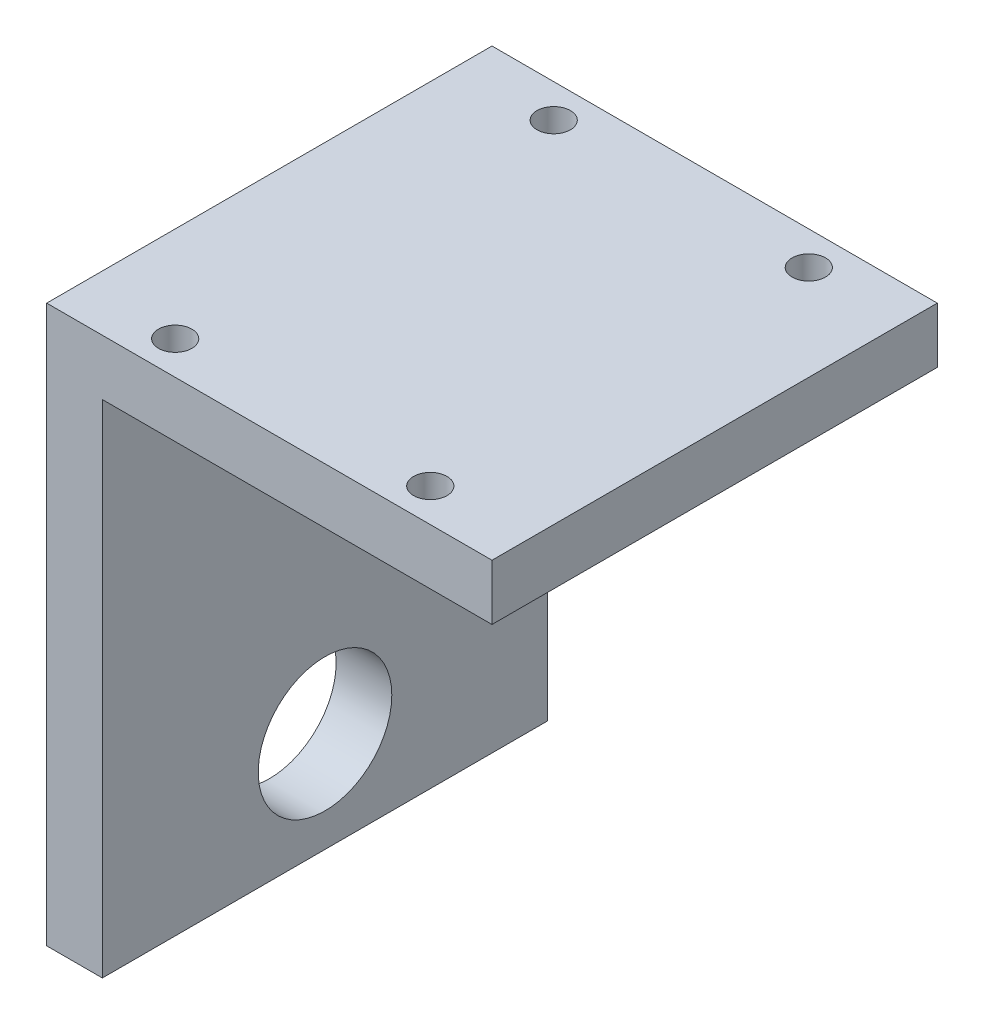
ISO-10303-21;
HEADER;
FILE_DESCRIPTION(('STEP AP214'),'2;1');
FILE_NAME('part.step','',(''),(''),'','','');
FILE_SCHEMA(('AUTOMOTIVE_DESIGN { 1 0 10303 214 1 1 1 1 }'));
ENDSEC;
DATA;
#1=APPLICATION_CONTEXT('core data for automotive mechanical design processes');
#2=APPLICATION_PROTOCOL_DEFINITION('international standard','automotive_design',2000,#1);
#3=PRODUCT_CONTEXT('',#1,'mechanical');
#4=PRODUCT('Part','Part','',(#3));
#5=PRODUCT_RELATED_PRODUCT_CATEGORY('part','',(#4));
#6=PRODUCT_DEFINITION_FORMATION('','',#4);
#7=PRODUCT_DEFINITION_CONTEXT('part definition',#1,'design');
#8=PRODUCT_DEFINITION('design','',#6,#7);
#9=PRODUCT_DEFINITION_SHAPE('','',#8);
#10=(LENGTH_UNIT() NAMED_UNIT(*) SI_UNIT(.MILLI.,.METRE.));
#11=(NAMED_UNIT(*) PLANE_ANGLE_UNIT() SI_UNIT($,.RADIAN.));
#12=(NAMED_UNIT(*) SI_UNIT($,.STERADIAN.) SOLID_ANGLE_UNIT());
#13=UNCERTAINTY_MEASURE_WITH_UNIT(LENGTH_MEASURE(1.E-05),#10,'distance_accuracy_value','');
#14=(GEOMETRIC_REPRESENTATION_CONTEXT(3) GLOBAL_UNCERTAINTY_ASSIGNED_CONTEXT((#13)) GLOBAL_UNIT_ASSIGNED_CONTEXT((#10,
#11,#12)) REPRESENTATION_CONTEXT('',''));
#15=CARTESIAN_POINT('',(0.,0.,0.));
#16=DIRECTION('',(0.,0.,1.));
#17=DIRECTION('',(1.,0.,0.));
#18=AXIS2_PLACEMENT_3D('',#15,#16,#17);
#19=CARTESIAN_POINT('',(0.,0.,0.));
#20=DIRECTION('',(0.,1.,0.));
#21=DIRECTION('',(0.,0.,1.));
#22=AXIS2_PLACEMENT_3D('',#19,#20,#21);
#23=PLANE('',#22);
#24=CARTESIAN_POINT('',(-11.4569960506188,0.,17.));
#25=DIRECTION('',(0.,1.,0.));
#26=DIRECTION('',(0.,0.,1.));
#27=AXIS2_PLACEMENT_3D('',#24,#25,#26);
#28=CIRCLE('',#27,1.5);
#29=CARTESIAN_POINT('',(-11.4569960506188,0.,18.5));
#30=VERTEX_POINT('',#29);
#31=EDGE_CURVE('E283',#30,#30,#28,.T.);
#32=ORIENTED_EDGE('',*,*,#31,.T.);
#33=EDGE_LOOP('',(#32));
#34=FACE_BOUND('',#33,.T.);
#35=CARTESIAN_POINT('',(11.4569960506188,0.,17.));
#36=DIRECTION('',(0.,1.,0.));
#37=DIRECTION('',(0.,0.,1.));
#38=AXIS2_PLACEMENT_3D('',#35,#36,#37);
#39=CIRCLE('',#38,1.5);
#40=CARTESIAN_POINT('',(11.4569960506188,0.,18.5));
#41=VERTEX_POINT('',#40);
#42=EDGE_CURVE('E286',#41,#41,#39,.T.);
#43=ORIENTED_EDGE('',*,*,#42,.T.);
#44=EDGE_LOOP('',(#43));
#45=FACE_BOUND('',#44,.T.);
#46=CARTESIAN_POINT('',(11.4569960506188,0.,-17.));
#47=DIRECTION('',(0.,1.,0.));
#48=DIRECTION('',(0.,0.,1.));
#49=AXIS2_PLACEMENT_3D('',#46,#47,#48);
#50=CIRCLE('',#49,1.5);
#51=CARTESIAN_POINT('',(11.4569960506188,0.,-15.5));
#52=VERTEX_POINT('',#51);
#53=EDGE_CURVE('E295',#52,#52,#50,.T.);
#54=ORIENTED_EDGE('',*,*,#53,.T.);
#55=EDGE_LOOP('',(#54));
#56=FACE_BOUND('',#55,.T.);
#57=CARTESIAN_POINT('',(-11.4569960506188,0.,-17.));
#58=DIRECTION('',(0.,1.,0.));
#59=DIRECTION('',(0.,0.,1.));
#60=AXIS2_PLACEMENT_3D('',#57,#58,#59);
#61=CIRCLE('',#60,1.5);
#62=CARTESIAN_POINT('',(-11.4569960506188,0.,-15.5));
#63=VERTEX_POINT('',#62);
#64=EDGE_CURVE('E304',#63,#63,#61,.T.);
#65=ORIENTED_EDGE('',*,*,#64,.T.);
#66=EDGE_LOOP('',(#65));
#67=FACE_BOUND('',#66,.T.);
#68=DIRECTION('',(0.,0.,1.));
#69=VECTOR('',#68,1.);
#70=CARTESIAN_POINT('',(-15.,0.,20.));
#71=LINE('',#70,#69);
#72=CARTESIAN_POINT('',(-15.,0.,-20.));
#73=VERTEX_POINT('',#72);
#74=CARTESIAN_POINT('',(-15.,0.,20.));
#75=VERTEX_POINT('',#74);
#76=EDGE_CURVE('E61',#73,#75,#71,.T.);
#77=ORIENTED_EDGE('',*,*,#76,.F.);
#78=DIRECTION('',(-1.,0.,0.));
#79=VECTOR('',#78,1.);
#80=CARTESIAN_POINT('',(-20.,0.,-20.));
#81=LINE('',#80,#79);
#82=CARTESIAN_POINT('',(20.,0.,-20.));
#83=VERTEX_POINT('',#82);
#84=EDGE_CURVE('E161',#83,#73,#81,.T.);
#85=ORIENTED_EDGE('',*,*,#84,.F.);
#86=DIRECTION('',(0.,0.,-1.));
#87=VECTOR('',#86,1.);
#88=CARTESIAN_POINT('',(20.,0.,-20.));
#89=LINE('',#88,#87);
#90=CARTESIAN_POINT('',(20.,0.,20.));
#91=VERTEX_POINT('',#90);
#92=EDGE_CURVE('E150',#91,#83,#89,.T.);
#93=ORIENTED_EDGE('',*,*,#92,.F.);
#94=DIRECTION('',(1.,0.,0.));
#95=VECTOR('',#94,1.);
#96=CARTESIAN_POINT('',(-20.,0.,20.));
#97=LINE('',#96,#95);
#98=EDGE_CURVE('E83',#75,#91,#97,.T.);
#99=ORIENTED_EDGE('',*,*,#98,.F.);
#100=EDGE_LOOP('',(#77,#85,#93,#99));
#101=FACE_BOUND('',#100,.T.);
#102=ADVANCED_FACE('F44',(#34,#45,#56,#67,#101),#23,.F.);
#103=CARTESIAN_POINT('',(20.,5.,-20.));
#104=DIRECTION('',(-1.,0.,0.));
#105=DIRECTION('',(0.,0.,1.));
#106=AXIS2_PLACEMENT_3D('',#103,#104,#105);
#107=PLANE('',#106);
#108=ORIENTED_EDGE('',*,*,#92,.T.);
#109=DIRECTION('',(0.,-1.,0.));
#110=VECTOR('',#109,1.);
#111=CARTESIAN_POINT('',(20.,5.,-20.));
#112=LINE('',#111,#110);
#113=CARTESIAN_POINT('',(20.,5.,-20.));
#114=VERTEX_POINT('',#113);
#115=EDGE_CURVE('E11',#114,#83,#112,.T.);
#116=ORIENTED_EDGE('',*,*,#115,.F.);
#117=DIRECTION('',(0.,0.,-1.));
#118=VECTOR('',#117,1.);
#119=CARTESIAN_POINT('',(20.,5.,-20.));
#120=LINE('',#119,#118);
#121=CARTESIAN_POINT('',(20.,5.,20.));
#122=VERTEX_POINT('',#121);
#123=EDGE_CURVE('E146',#122,#114,#120,.T.);
#124=ORIENTED_EDGE('',*,*,#123,.F.);
#125=DIRECTION('',(0.,-1.,0.));
#126=VECTOR('',#125,1.);
#127=CARTESIAN_POINT('',(20.,5.,20.));
#128=LINE('',#127,#126);
#129=EDGE_CURVE('E160',#122,#91,#128,.T.);
#130=ORIENTED_EDGE('',*,*,#129,.T.);
#131=EDGE_LOOP('',(#108,#116,#124,#130));
#132=FACE_BOUND('',#131,.T.);
#133=ADVANCED_FACE('F50',(#132),#107,.F.);
#134=CARTESIAN_POINT('',(-20.,5.,-20.));
#135=DIRECTION('',(0.,0.,1.));
#136=DIRECTION('',(1.,0.,0.));
#137=AXIS2_PLACEMENT_3D('',#134,#135,#136);
#138=PLANE('',#137);
#139=ORIENTED_EDGE('',*,*,#84,.T.);
#140=DIRECTION('',(0.,1.,0.));
#141=VECTOR('',#140,1.);
#142=CARTESIAN_POINT('',(-15.,-45.,-20.));
#143=LINE('',#142,#141);
#144=CARTESIAN_POINT('',(-15.,-45.,-20.));
#145=VERTEX_POINT('',#144);
#146=EDGE_CURVE('E118',#145,#73,#143,.T.);
#147=ORIENTED_EDGE('',*,*,#146,.F.);
#148=DIRECTION('',(1.,0.,0.));
#149=VECTOR('',#148,1.);
#150=CARTESIAN_POINT('',(-20.,-45.,-20.));
#151=LINE('',#150,#149);
#152=CARTESIAN_POINT('',(-20.,-45.,-20.));
#153=VERTEX_POINT('',#152);
#154=EDGE_CURVE('E116',#153,#145,#151,.T.);
#155=ORIENTED_EDGE('',*,*,#154,.F.);
#156=DIRECTION('',(0.,-1.,0.));
#157=VECTOR('',#156,1.);
#158=CARTESIAN_POINT('',(-20.,5.,-20.));
#159=LINE('',#158,#157);
#160=CARTESIAN_POINT('',(-20.,5.,-20.));
#161=VERTEX_POINT('',#160);
#162=EDGE_CURVE('E53',#161,#153,#159,.T.);
#163=ORIENTED_EDGE('',*,*,#162,.F.);
#164=DIRECTION('',(-1.,0.,0.));
#165=VECTOR('',#164,1.);
#166=CARTESIAN_POINT('',(-20.,5.,-20.));
#167=LINE('',#166,#165);
#168=EDGE_CURVE('E89',#114,#161,#167,.T.);
#169=ORIENTED_EDGE('',*,*,#168,.F.);
#170=ORIENTED_EDGE('',*,*,#115,.T.);
#171=EDGE_LOOP('',(#139,#147,#155,#163,#169,#170));
#172=FACE_BOUND('',#171,.T.);
#173=ADVANCED_FACE('F117',(#172),#138,.F.);
#174=CARTESIAN_POINT('',(-20.,5.,-20.));
#175=DIRECTION('',(1.,0.,0.));
#176=DIRECTION('',(0.,0.,-1.));
#177=AXIS2_PLACEMENT_3D('',#174,#175,#176);
#178=PLANE('',#177);
#179=CARTESIAN_POINT('',(-20.,-36.,0.));
#180=DIRECTION('',(1.,0.,0.));
#181=DIRECTION('',(0.,0.,-1.));
#182=AXIS2_PLACEMENT_3D('',#179,#180,#181);
#183=CIRCLE('',#182,6.);
#184=CARTESIAN_POINT('',(-20.,-36.,-6.00000000000001));
#185=VERTEX_POINT('',#184);
#186=EDGE_CURVE('E132',#185,#185,#183,.T.);
#187=ORIENTED_EDGE('',*,*,#186,.T.);
#188=EDGE_LOOP('',(#187));
#189=FACE_BOUND('',#188,.T.);
#190=ORIENTED_EDGE('',*,*,#162,.T.);
#191=DIRECTION('',(0.,0.,-1.));
#192=VECTOR('',#191,1.);
#193=CARTESIAN_POINT('',(-20.,-45.,20.));
#194=LINE('',#193,#192);
#195=CARTESIAN_POINT('',(-20.,-45.,20.));
#196=VERTEX_POINT('',#195);
#197=EDGE_CURVE('E112',#196,#153,#194,.T.);
#198=ORIENTED_EDGE('',*,*,#197,.F.);
#199=DIRECTION('',(0.,-1.,0.));
#200=VECTOR('',#199,1.);
#201=CARTESIAN_POINT('',(-20.,5.,20.));
#202=LINE('',#201,#200);
#203=CARTESIAN_POINT('',(-20.,5.,20.));
#204=VERTEX_POINT('',#203);
#205=EDGE_CURVE('E111',#204,#196,#202,.T.);
#206=ORIENTED_EDGE('',*,*,#205,.F.);
#207=DIRECTION('',(0.,0.,1.));
#208=VECTOR('',#207,1.);
#209=CARTESIAN_POINT('',(-20.,5.,-20.));
#210=LINE('',#209,#208);
#211=EDGE_CURVE('E115',#161,#204,#210,.T.);
#212=ORIENTED_EDGE('',*,*,#211,.F.);
#213=EDGE_LOOP('',(#190,#198,#206,#212));
#214=FACE_BOUND('',#213,.T.);
#215=ADVANCED_FACE('F107',(#189,#214),#178,.F.);
#216=CARTESIAN_POINT('',(-20.,5.,20.));
#217=DIRECTION('',(0.,0.,-1.));
#218=DIRECTION('',(-1.,0.,0.));
#219=AXIS2_PLACEMENT_3D('',#216,#217,#218);
#220=PLANE('',#219);
#221=ORIENTED_EDGE('',*,*,#205,.T.);
#222=DIRECTION('',(-1.,0.,0.));
#223=VECTOR('',#222,1.);
#224=CARTESIAN_POINT('',(-20.,-45.,20.));
#225=LINE('',#224,#223);
#226=CARTESIAN_POINT('',(-15.,-45.,20.));
#227=VERTEX_POINT('',#226);
#228=EDGE_CURVE('E126',#227,#196,#225,.T.);
#229=ORIENTED_EDGE('',*,*,#228,.F.);
#230=DIRECTION('',(0.,1.,0.));
#231=VECTOR('',#230,1.);
#232=CARTESIAN_POINT('',(-15.,-45.,20.));
#233=LINE('',#232,#231);
#234=EDGE_CURVE('E143',#227,#75,#233,.T.);
#235=ORIENTED_EDGE('',*,*,#234,.T.);
#236=ORIENTED_EDGE('',*,*,#98,.T.);
#237=ORIENTED_EDGE('',*,*,#129,.F.);
#238=DIRECTION('',(1.,0.,0.));
#239=VECTOR('',#238,1.);
#240=CARTESIAN_POINT('',(-20.,5.,20.));
#241=LINE('',#240,#239);
#242=EDGE_CURVE('E69',#204,#122,#241,.T.);
#243=ORIENTED_EDGE('',*,*,#242,.F.);
#244=EDGE_LOOP('',(#221,#229,#235,#236,#237,#243));
#245=FACE_BOUND('',#244,.T.);
#246=ADVANCED_FACE('F166',(#245),#220,.F.);
#247=CARTESIAN_POINT('',(0.,5.,0.));
#248=DIRECTION('',(0.,1.,0.));
#249=DIRECTION('',(0.,0.,1.));
#250=AXIS2_PLACEMENT_3D('',#247,#248,#249);
#251=PLANE('',#250);
#252=CARTESIAN_POINT('',(-11.4569960506188,5.,17.));
#253=DIRECTION('',(0.,1.,0.));
#254=DIRECTION('',(0.,0.,-1.));
#255=AXIS2_PLACEMENT_3D('',#252,#253,#254);
#256=CIRCLE('',#255,1.5);
#257=CARTESIAN_POINT('',(-11.4569960506188,5.,18.5));
#258=VERTEX_POINT('',#257);
#259=EDGE_CURVE('E282',#258,#258,#256,.T.);
#260=ORIENTED_EDGE('',*,*,#259,.F.);
#261=EDGE_LOOP('',(#260));
#262=FACE_BOUND('',#261,.T.);
#263=CARTESIAN_POINT('',(11.4569960506188,5.,17.));
#264=DIRECTION('',(0.,1.,0.));
#265=DIRECTION('',(0.,0.,1.));
#266=AXIS2_PLACEMENT_3D('',#263,#264,#265);
#267=CIRCLE('',#266,1.5);
#268=CARTESIAN_POINT('',(11.4569960506188,5.,18.5));
#269=VERTEX_POINT('',#268);
#270=EDGE_CURVE('E316',#269,#269,#267,.T.);
#271=ORIENTED_EDGE('',*,*,#270,.F.);
#272=EDGE_LOOP('',(#271));
#273=FACE_BOUND('',#272,.T.);
#274=CARTESIAN_POINT('',(11.4569960506188,5.,-17.));
#275=DIRECTION('',(0.,1.,0.));
#276=DIRECTION('',(0.,0.,-1.));
#277=AXIS2_PLACEMENT_3D('',#274,#275,#276);
#278=CIRCLE('',#277,1.5);
#279=CARTESIAN_POINT('',(11.4569960506188,5.,-15.5));
#280=VERTEX_POINT('',#279);
#281=EDGE_CURVE('E311',#280,#280,#278,.T.);
#282=ORIENTED_EDGE('',*,*,#281,.F.);
#283=EDGE_LOOP('',(#282));
#284=FACE_BOUND('',#283,.T.);
#285=CARTESIAN_POINT('',(-11.4569960506188,5.,-17.));
#286=DIRECTION('',(0.,1.,0.));
#287=DIRECTION('',(0.,0.,1.));
#288=AXIS2_PLACEMENT_3D('',#285,#286,#287);
#289=CIRCLE('',#288,1.5);
#290=CARTESIAN_POINT('',(-11.4569960506188,5.,-15.5));
#291=VERTEX_POINT('',#290);
#292=EDGE_CURVE('E310',#291,#291,#289,.T.);
#293=ORIENTED_EDGE('',*,*,#292,.F.);
#294=EDGE_LOOP('',(#293));
#295=FACE_BOUND('',#294,.T.);
#296=ORIENTED_EDGE('',*,*,#123,.T.);
#297=ORIENTED_EDGE('',*,*,#168,.T.);
#298=ORIENTED_EDGE('',*,*,#211,.T.);
#299=ORIENTED_EDGE('',*,*,#242,.T.);
#300=EDGE_LOOP('',(#296,#297,#298,#299));
#301=FACE_BOUND('',#300,.T.);
#302=ADVANCED_FACE('F173',(#262,#273,#284,#295,#301),#251,.T.);
#303=CARTESIAN_POINT('',(-15.,-45.,20.));
#304=DIRECTION('',(-1.,0.,0.));
#305=DIRECTION('',(0.,0.,1.));
#306=AXIS2_PLACEMENT_3D('',#303,#304,#305);
#307=PLANE('',#306);
#308=CARTESIAN_POINT('',(-15.,-36.,0.));
#309=DIRECTION('',(1.,0.,0.));
#310=DIRECTION('',(0.,0.,-1.));
#311=AXIS2_PLACEMENT_3D('',#308,#309,#310);
#312=CIRCLE('',#311,6.);
#313=CARTESIAN_POINT('',(-15.,-36.,-6.));
#314=VERTEX_POINT('',#313);
#315=EDGE_CURVE('E135',#314,#314,#312,.T.);
#316=ORIENTED_EDGE('',*,*,#315,.F.);
#317=EDGE_LOOP('',(#316));
#318=FACE_BOUND('',#317,.T.);
#319=ORIENTED_EDGE('',*,*,#76,.T.);
#320=ORIENTED_EDGE('',*,*,#234,.F.);
#321=DIRECTION('',(0.,0.,1.));
#322=VECTOR('',#321,1.);
#323=CARTESIAN_POINT('',(-15.,-45.,20.));
#324=LINE('',#323,#322);
#325=EDGE_CURVE('E123',#145,#227,#324,.T.);
#326=ORIENTED_EDGE('',*,*,#325,.F.);
#327=ORIENTED_EDGE('',*,*,#146,.T.);
#328=EDGE_LOOP('',(#319,#320,#326,#327));
#329=FACE_BOUND('',#328,.T.);
#330=ADVANCED_FACE('F176',(#318,#329),#307,.F.);
#331=CARTESIAN_POINT('',(0.,-45.,0.));
#332=DIRECTION('',(0.,-1.,0.));
#333=DIRECTION('',(0.,0.,-1.));
#334=AXIS2_PLACEMENT_3D('',#331,#332,#333);
#335=PLANE('',#334);
#336=ORIENTED_EDGE('',*,*,#197,.T.);
#337=ORIENTED_EDGE('',*,*,#154,.T.);
#338=ORIENTED_EDGE('',*,*,#325,.T.);
#339=ORIENTED_EDGE('',*,*,#228,.T.);
#340=EDGE_LOOP('',(#336,#337,#338,#339));
#341=FACE_BOUND('',#340,.T.);
#342=ADVANCED_FACE('F127',(#341),#335,.T.);
#343=CARTESIAN_POINT('',(-20.,-36.,0.));
#344=DIRECTION('',(1.,0.,0.));
#345=DIRECTION('',(0.,0.,-1.));
#346=AXIS2_PLACEMENT_3D('',#343,#344,#345);
#347=CYLINDRICAL_SURFACE('',#346,6.);
#348=ORIENTED_EDGE('',*,*,#186,.F.);
#349=EDGE_LOOP('',(#348));
#350=FACE_BOUND('',#349,.T.);
#351=ORIENTED_EDGE('',*,*,#315,.T.);
#352=EDGE_LOOP('',(#351));
#353=FACE_BOUND('',#352,.T.);
#354=ADVANCED_FACE('F219',(#350,#353),#347,.F.);
#355=CARTESIAN_POINT('',(-11.4569960506188,-45.,-17.));
#356=DIRECTION('',(0.,1.,0.));
#357=DIRECTION('',(0.,0.,1.));
#358=AXIS2_PLACEMENT_3D('',#355,#356,#357);
#359=CYLINDRICAL_SURFACE('',#358,1.5);
#360=CARTESIAN_POINT('',(-11.4569960506188,5.,-15.5));
#361=CARTESIAN_POINT('',(-11.4569960506188,4.94791666666667,-15.5));
#362=CARTESIAN_POINT('',(-11.4569960506188,4.89583333333333,-15.5));
#363=CARTESIAN_POINT('',(-11.4569960506188,4.79166666666667,-15.5));
#364=CARTESIAN_POINT('',(-11.4569960506188,4.73958333333333,-15.5));
#365=CARTESIAN_POINT('',(-11.4569960506188,4.63541666666666,-15.5));
#366=CARTESIAN_POINT('',(-11.4569960506188,4.58333333333333,-15.5));
#367=CARTESIAN_POINT('',(-11.4569960506188,4.47916666666666,-15.5));
#368=CARTESIAN_POINT('',(-11.4569960506188,4.42708333333333,-15.5));
#369=CARTESIAN_POINT('',(-11.4569960506188,4.32291666666667,-15.5));
#370=CARTESIAN_POINT('',(-11.4569960506188,4.27083333333333,-15.5));
#371=CARTESIAN_POINT('',(-11.4569960506188,4.16666666666667,-15.5));
#372=CARTESIAN_POINT('',(-11.4569960506188,4.11458333333333,-15.5));
#373=CARTESIAN_POINT('',(-11.4569960506188,4.01041666666666,-15.5));
#374=CARTESIAN_POINT('',(-11.4569960506188,3.95833333333333,-15.5));
#375=CARTESIAN_POINT('',(-11.4569960506188,3.85416666666666,-15.5));
#376=CARTESIAN_POINT('',(-11.4569960506188,3.80208333333333,-15.5));
#377=CARTESIAN_POINT('',(-11.4569960506188,3.69791666666666,-15.5));
#378=CARTESIAN_POINT('',(-11.4569960506188,3.64583333333333,-15.5));
#379=CARTESIAN_POINT('',(-11.4569960506188,3.54166666666667,-15.5));
#380=CARTESIAN_POINT('',(-11.4569960506188,3.48958333333333,-15.5));
#381=CARTESIAN_POINT('',(-11.4569960506188,3.38541666666666,-15.5));
#382=CARTESIAN_POINT('',(-11.4569960506188,3.33333333333333,-15.5));
#383=CARTESIAN_POINT('',(-11.4569960506188,3.22916666666666,-15.5));
#384=CARTESIAN_POINT('',(-11.4569960506188,3.17708333333333,-15.5));
#385=CARTESIAN_POINT('',(-11.4569960506188,3.07291666666666,-15.5));
#386=CARTESIAN_POINT('',(-11.4569960506188,3.02083333333333,-15.5));
#387=CARTESIAN_POINT('',(-11.4569960506188,2.91666666666666,-15.5));
#388=CARTESIAN_POINT('',(-11.4569960506188,2.86458333333333,-15.5));
#389=CARTESIAN_POINT('',(-11.4569960506188,2.76041666666666,-15.5));
#390=CARTESIAN_POINT('',(-11.4569960506188,2.70833333333333,-15.5));
#391=CARTESIAN_POINT('',(-11.4569960506188,2.60416666666666,-15.5));
#392=CARTESIAN_POINT('',(-11.4569960506188,2.55208333333333,-15.5));
#393=CARTESIAN_POINT('',(-11.4569960506188,2.44791666666666,-15.5));
#394=CARTESIAN_POINT('',(-11.4569960506188,2.39583333333333,-15.5));
#395=CARTESIAN_POINT('',(-11.4569960506188,2.29166666666666,-15.5));
#396=CARTESIAN_POINT('',(-11.4569960506188,2.23958333333333,-15.5));
#397=CARTESIAN_POINT('',(-11.4569960506188,2.13541666666666,-15.5));
#398=CARTESIAN_POINT('',(-11.4569960506188,2.08333333333333,-15.5));
#399=CARTESIAN_POINT('',(-11.4569960506188,1.97916666666666,-15.5));
#400=CARTESIAN_POINT('',(-11.4569960506188,1.92708333333333,-15.5));
#401=CARTESIAN_POINT('',(-11.4569960506188,1.82291666666666,-15.5));
#402=CARTESIAN_POINT('',(-11.4569960506188,1.77083333333333,-15.5));
#403=CARTESIAN_POINT('',(-11.4569960506188,1.66666666666666,-15.5));
#404=CARTESIAN_POINT('',(-11.4569960506188,1.61458333333333,-15.5));
#405=CARTESIAN_POINT('',(-11.4569960506188,1.51041666666666,-15.5));
#406=CARTESIAN_POINT('',(-11.4569960506188,1.45833333333333,-15.5));
#407=CARTESIAN_POINT('',(-11.4569960506188,1.35416666666666,-15.5));
#408=CARTESIAN_POINT('',(-11.4569960506188,1.30208333333333,-15.5));
#409=CARTESIAN_POINT('',(-11.4569960506188,1.19791666666666,-15.5));
#410=CARTESIAN_POINT('',(-11.4569960506188,1.14583333333333,-15.5));
#411=CARTESIAN_POINT('',(-11.4569960506188,1.04166666666666,-15.5));
#412=CARTESIAN_POINT('',(-11.4569960506188,0.989583333333328,-15.5));
#413=CARTESIAN_POINT('',(-11.4569960506188,0.885416666666659,-15.5));
#414=CARTESIAN_POINT('',(-11.4569960506188,0.833333333333325,-15.5));
#415=CARTESIAN_POINT('',(-11.4569960506188,0.729166666666658,-15.5));
#416=CARTESIAN_POINT('',(-11.4569960506188,0.677083333333326,-15.5));
#417=CARTESIAN_POINT('',(-11.4569960506188,0.572916666666661,-15.5));
#418=CARTESIAN_POINT('',(-11.4569960506188,0.520833333333329,-15.5));
#419=CARTESIAN_POINT('',(-11.4569960506188,0.416666666666662,-15.5));
#420=CARTESIAN_POINT('',(-11.4569960506188,0.364583333333328,-15.5));
#421=CARTESIAN_POINT('',(-11.4569960506188,0.260416666666659,-15.5));
#422=CARTESIAN_POINT('',(-11.4569960506188,0.208333333333324,-15.5));
#423=CARTESIAN_POINT('',(-11.4569960506188,0.104166666666657,-15.5));
#424=CARTESIAN_POINT('',(-11.4569960506188,0.0520833333333252,-15.5));
#425=CARTESIAN_POINT('',(-11.4569960506188,0.,-15.5));
#426=B_SPLINE_CURVE_WITH_KNOTS('',3,(#360,#361,#362,#363,#364,#365,#366,#367,#368,#369,#370,
#371,#372,#373,#374,#375,#376,#377,#378,#379,#380,#381,#382,#383,#384,#385,#386,#387,#388,#389,
#390,#391,#392,#393,#394,#395,#396,#397,#398,#399,#400,#401,#402,#403,#404,#405,#406,#407,#408,
#409,#410,#411,#412,#413,#414,#415,#416,#417,#418,#419,#420,#421,#422,#423,#424,#425),
.UNSPECIFIED.,.F.,.F.,(4,2,2,2,2,2,2,2,2,2,2,2,2,2,2,2,2,2,2,2,2,2,2,2,2,2,2,2,2,2,2,2,4),(0.,
0.156249999999997,0.3125,0.468750000000004,0.625000000000001,0.781249999999997,
0.937500000000001,1.09375,1.25,1.40625,1.5625,1.71875,1.875,2.03125,2.1875,2.34375000000001,2.5,
2.65625,2.8125,2.96875000000001,3.125,3.28125,3.4375,3.59375000000001,3.75,3.90625,4.0625,
4.21875000000001,4.375,4.53125,4.6875,4.84375000000001,5.),.UNSPECIFIED.);
#427=EDGE_CURVE('BSEAM234',#291,#63,#426,.T.);
#428=ORIENTED_EDGE('',*,*,#292,.T.);
#429=ORIENTED_EDGE('',*,*,#64,.F.);
#430=ORIENTED_EDGE('',*,*,#427,.T.);
#431=ORIENTED_EDGE('',*,*,#427,.F.);
#432=EDGE_LOOP('',(#428,#430,#429,#431));
#433=FACE_BOUND('',#432,.T.);
#434=ADVANCED_FACE('F234',(#433),#359,.F.);
#435=CARTESIAN_POINT('',(11.4569960506188,-45.,-17.));
#436=DIRECTION('',(0.,1.,0.));
#437=DIRECTION('',(0.,0.,1.));
#438=AXIS2_PLACEMENT_3D('',#435,#436,#437);
#439=CYLINDRICAL_SURFACE('',#438,1.5);
#440=CARTESIAN_POINT('',(11.4569960506188,5.,-15.5));
#441=CARTESIAN_POINT('',(11.4569960506188,4.94791666666667,-15.5));
#442=CARTESIAN_POINT('',(11.4569960506188,4.89583333333333,-15.5));
#443=CARTESIAN_POINT('',(11.4569960506188,4.79166666666667,-15.5));
#444=CARTESIAN_POINT('',(11.4569960506188,4.73958333333333,-15.5));
#445=CARTESIAN_POINT('',(11.4569960506188,4.63541666666666,-15.5));
#446=CARTESIAN_POINT('',(11.4569960506188,4.58333333333333,-15.5));
#447=CARTESIAN_POINT('',(11.4569960506188,4.47916666666666,-15.5));
#448=CARTESIAN_POINT('',(11.4569960506188,4.42708333333333,-15.5));
#449=CARTESIAN_POINT('',(11.4569960506188,4.32291666666667,-15.5));
#450=CARTESIAN_POINT('',(11.4569960506188,4.27083333333333,-15.5));
#451=CARTESIAN_POINT('',(11.4569960506188,4.16666666666667,-15.5));
#452=CARTESIAN_POINT('',(11.4569960506188,4.11458333333333,-15.5));
#453=CARTESIAN_POINT('',(11.4569960506188,4.01041666666666,-15.5));
#454=CARTESIAN_POINT('',(11.4569960506188,3.95833333333333,-15.5));
#455=CARTESIAN_POINT('',(11.4569960506188,3.85416666666666,-15.5));
#456=CARTESIAN_POINT('',(11.4569960506188,3.80208333333333,-15.5));
#457=CARTESIAN_POINT('',(11.4569960506188,3.69791666666666,-15.5));
#458=CARTESIAN_POINT('',(11.4569960506188,3.64583333333333,-15.5));
#459=CARTESIAN_POINT('',(11.4569960506188,3.54166666666667,-15.5));
#460=CARTESIAN_POINT('',(11.4569960506188,3.48958333333333,-15.5));
#461=CARTESIAN_POINT('',(11.4569960506188,3.38541666666666,-15.5));
#462=CARTESIAN_POINT('',(11.4569960506188,3.33333333333333,-15.5));
#463=CARTESIAN_POINT('',(11.4569960506188,3.22916666666666,-15.5));
#464=CARTESIAN_POINT('',(11.4569960506188,3.17708333333333,-15.5));
#465=CARTESIAN_POINT('',(11.4569960506188,3.07291666666666,-15.5));
#466=CARTESIAN_POINT('',(11.4569960506188,3.02083333333333,-15.5));
#467=CARTESIAN_POINT('',(11.4569960506188,2.91666666666666,-15.5));
#468=CARTESIAN_POINT('',(11.4569960506188,2.86458333333333,-15.5));
#469=CARTESIAN_POINT('',(11.4569960506188,2.76041666666666,-15.5));
#470=CARTESIAN_POINT('',(11.4569960506188,2.70833333333333,-15.5));
#471=CARTESIAN_POINT('',(11.4569960506188,2.60416666666666,-15.5));
#472=CARTESIAN_POINT('',(11.4569960506188,2.55208333333333,-15.5));
#473=CARTESIAN_POINT('',(11.4569960506188,2.44791666666666,-15.5));
#474=CARTESIAN_POINT('',(11.4569960506188,2.39583333333333,-15.5));
#475=CARTESIAN_POINT('',(11.4569960506188,2.29166666666666,-15.5));
#476=CARTESIAN_POINT('',(11.4569960506188,2.23958333333333,-15.5));
#477=CARTESIAN_POINT('',(11.4569960506188,2.13541666666666,-15.5));
#478=CARTESIAN_POINT('',(11.4569960506188,2.08333333333333,-15.5));
#479=CARTESIAN_POINT('',(11.4569960506188,1.97916666666666,-15.5));
#480=CARTESIAN_POINT('',(11.4569960506188,1.92708333333333,-15.5));
#481=CARTESIAN_POINT('',(11.4569960506188,1.82291666666666,-15.5));
#482=CARTESIAN_POINT('',(11.4569960506188,1.77083333333333,-15.5));
#483=CARTESIAN_POINT('',(11.4569960506188,1.66666666666666,-15.5));
#484=CARTESIAN_POINT('',(11.4569960506188,1.61458333333333,-15.5));
#485=CARTESIAN_POINT('',(11.4569960506188,1.51041666666666,-15.5));
#486=CARTESIAN_POINT('',(11.4569960506188,1.45833333333333,-15.5));
#487=CARTESIAN_POINT('',(11.4569960506188,1.35416666666666,-15.5));
#488=CARTESIAN_POINT('',(11.4569960506188,1.30208333333333,-15.5));
#489=CARTESIAN_POINT('',(11.4569960506188,1.19791666666666,-15.5));
#490=CARTESIAN_POINT('',(11.4569960506188,1.14583333333333,-15.5));
#491=CARTESIAN_POINT('',(11.4569960506188,1.04166666666666,-15.5));
#492=CARTESIAN_POINT('',(11.4569960506188,0.989583333333328,-15.5));
#493=CARTESIAN_POINT('',(11.4569960506188,0.885416666666659,-15.5));
#494=CARTESIAN_POINT('',(11.4569960506188,0.833333333333325,-15.5));
#495=CARTESIAN_POINT('',(11.4569960506188,0.729166666666658,-15.5));
#496=CARTESIAN_POINT('',(11.4569960506188,0.677083333333326,-15.5));
#497=CARTESIAN_POINT('',(11.4569960506188,0.572916666666661,-15.5));
#498=CARTESIAN_POINT('',(11.4569960506188,0.520833333333329,-15.5));
#499=CARTESIAN_POINT('',(11.4569960506188,0.416666666666662,-15.5));
#500=CARTESIAN_POINT('',(11.4569960506188,0.364583333333328,-15.5));
#501=CARTESIAN_POINT('',(11.4569960506188,0.260416666666659,-15.5));
#502=CARTESIAN_POINT('',(11.4569960506188,0.208333333333324,-15.5));
#503=CARTESIAN_POINT('',(11.4569960506188,0.104166666666657,-15.5));
#504=CARTESIAN_POINT('',(11.4569960506188,0.0520833333333252,-15.5));
#505=CARTESIAN_POINT('',(11.4569960506188,0.,-15.5));
#506=B_SPLINE_CURVE_WITH_KNOTS('',3,(#440,#441,#442,#443,#444,#445,#446,#447,#448,#449,#450,
#451,#452,#453,#454,#455,#456,#457,#458,#459,#460,#461,#462,#463,#464,#465,#466,#467,#468,#469,
#470,#471,#472,#473,#474,#475,#476,#477,#478,#479,#480,#481,#482,#483,#484,#485,#486,#487,#488,
#489,#490,#491,#492,#493,#494,#495,#496,#497,#498,#499,#500,#501,#502,#503,#504,#505),
.UNSPECIFIED.,.F.,.F.,(4,2,2,2,2,2,2,2,2,2,2,2,2,2,2,2,2,2,2,2,2,2,2,2,2,2,2,2,2,2,2,2,4),(0.,
0.156249999999997,0.3125,0.468750000000004,0.625000000000001,0.781249999999997,
0.937500000000001,1.09375,1.25,1.40625,1.5625,1.71875,1.875,2.03125,2.1875,2.34375000000001,2.5,
2.65625,2.8125,2.96875000000001,3.125,3.28125,3.4375,3.59375000000001,3.75,3.90625,4.0625,
4.21875000000001,4.375,4.53125,4.6875,4.84375000000001,5.),.UNSPECIFIED.);
#507=EDGE_CURVE('BSEAM250',#280,#52,#506,.T.);
#508=ORIENTED_EDGE('',*,*,#281,.T.);
#509=ORIENTED_EDGE('',*,*,#53,.F.);
#510=ORIENTED_EDGE('',*,*,#507,.T.);
#511=ORIENTED_EDGE('',*,*,#507,.F.);
#512=EDGE_LOOP('',(#508,#510,#509,#511));
#513=FACE_BOUND('',#512,.T.);
#514=ADVANCED_FACE('F250',(#513),#439,.F.);
#515=CARTESIAN_POINT('',(11.4569960506188,-45.,17.));
#516=DIRECTION('',(0.,1.,0.));
#517=DIRECTION('',(0.,0.,1.));
#518=AXIS2_PLACEMENT_3D('',#515,#516,#517);
#519=CYLINDRICAL_SURFACE('',#518,1.5);
#520=CARTESIAN_POINT('',(11.4569960506188,5.,18.5));
#521=CARTESIAN_POINT('',(11.4569960506188,4.94791666666667,18.5));
#522=CARTESIAN_POINT('',(11.4569960506188,4.89583333333333,18.5));
#523=CARTESIAN_POINT('',(11.4569960506188,4.79166666666667,18.5));
#524=CARTESIAN_POINT('',(11.4569960506188,4.73958333333333,18.5));
#525=CARTESIAN_POINT('',(11.4569960506188,4.63541666666666,18.5));
#526=CARTESIAN_POINT('',(11.4569960506188,4.58333333333333,18.5));
#527=CARTESIAN_POINT('',(11.4569960506188,4.47916666666666,18.5));
#528=CARTESIAN_POINT('',(11.4569960506188,4.42708333333333,18.5));
#529=CARTESIAN_POINT('',(11.4569960506188,4.32291666666667,18.5));
#530=CARTESIAN_POINT('',(11.4569960506188,4.27083333333333,18.5));
#531=CARTESIAN_POINT('',(11.4569960506188,4.16666666666667,18.5));
#532=CARTESIAN_POINT('',(11.4569960506188,4.11458333333333,18.5));
#533=CARTESIAN_POINT('',(11.4569960506188,4.01041666666666,18.5));
#534=CARTESIAN_POINT('',(11.4569960506188,3.95833333333333,18.5));
#535=CARTESIAN_POINT('',(11.4569960506188,3.85416666666666,18.5));
#536=CARTESIAN_POINT('',(11.4569960506188,3.80208333333333,18.5));
#537=CARTESIAN_POINT('',(11.4569960506188,3.69791666666666,18.5));
#538=CARTESIAN_POINT('',(11.4569960506188,3.64583333333333,18.5));
#539=CARTESIAN_POINT('',(11.4569960506188,3.54166666666667,18.5));
#540=CARTESIAN_POINT('',(11.4569960506188,3.48958333333333,18.5));
#541=CARTESIAN_POINT('',(11.4569960506188,3.38541666666666,18.5));
#542=CARTESIAN_POINT('',(11.4569960506188,3.33333333333333,18.5));
#543=CARTESIAN_POINT('',(11.4569960506188,3.22916666666666,18.5));
#544=CARTESIAN_POINT('',(11.4569960506188,3.17708333333333,18.5));
#545=CARTESIAN_POINT('',(11.4569960506188,3.07291666666666,18.5));
#546=CARTESIAN_POINT('',(11.4569960506188,3.02083333333333,18.5));
#547=CARTESIAN_POINT('',(11.4569960506188,2.91666666666666,18.5));
#548=CARTESIAN_POINT('',(11.4569960506188,2.86458333333333,18.5));
#549=CARTESIAN_POINT('',(11.4569960506188,2.76041666666666,18.5));
#550=CARTESIAN_POINT('',(11.4569960506188,2.70833333333333,18.5));
#551=CARTESIAN_POINT('',(11.4569960506188,2.60416666666666,18.5));
#552=CARTESIAN_POINT('',(11.4569960506188,2.55208333333333,18.5));
#553=CARTESIAN_POINT('',(11.4569960506188,2.44791666666666,18.5));
#554=CARTESIAN_POINT('',(11.4569960506188,2.39583333333333,18.5));
#555=CARTESIAN_POINT('',(11.4569960506188,2.29166666666666,18.5));
#556=CARTESIAN_POINT('',(11.4569960506188,2.23958333333333,18.5));
#557=CARTESIAN_POINT('',(11.4569960506188,2.13541666666666,18.5));
#558=CARTESIAN_POINT('',(11.4569960506188,2.08333333333333,18.5));
#559=CARTESIAN_POINT('',(11.4569960506188,1.97916666666666,18.5));
#560=CARTESIAN_POINT('',(11.4569960506188,1.92708333333333,18.5));
#561=CARTESIAN_POINT('',(11.4569960506188,1.82291666666666,18.5));
#562=CARTESIAN_POINT('',(11.4569960506188,1.77083333333333,18.5));
#563=CARTESIAN_POINT('',(11.4569960506188,1.66666666666666,18.5));
#564=CARTESIAN_POINT('',(11.4569960506188,1.61458333333333,18.5));
#565=CARTESIAN_POINT('',(11.4569960506188,1.51041666666666,18.5));
#566=CARTESIAN_POINT('',(11.4569960506188,1.45833333333333,18.5));
#567=CARTESIAN_POINT('',(11.4569960506188,1.35416666666666,18.5));
#568=CARTESIAN_POINT('',(11.4569960506188,1.30208333333333,18.5));
#569=CARTESIAN_POINT('',(11.4569960506188,1.19791666666666,18.5));
#570=CARTESIAN_POINT('',(11.4569960506188,1.14583333333333,18.5));
#571=CARTESIAN_POINT('',(11.4569960506188,1.04166666666666,18.5));
#572=CARTESIAN_POINT('',(11.4569960506188,0.989583333333328,18.5));
#573=CARTESIAN_POINT('',(11.4569960506188,0.885416666666659,18.5));
#574=CARTESIAN_POINT('',(11.4569960506188,0.833333333333325,18.5));
#575=CARTESIAN_POINT('',(11.4569960506188,0.729166666666658,18.5));
#576=CARTESIAN_POINT('',(11.4569960506188,0.677083333333326,18.5));
#577=CARTESIAN_POINT('',(11.4569960506188,0.572916666666661,18.5));
#578=CARTESIAN_POINT('',(11.4569960506188,0.520833333333329,18.5));
#579=CARTESIAN_POINT('',(11.4569960506188,0.416666666666662,18.5));
#580=CARTESIAN_POINT('',(11.4569960506188,0.364583333333328,18.5));
#581=CARTESIAN_POINT('',(11.4569960506188,0.260416666666659,18.5));
#582=CARTESIAN_POINT('',(11.4569960506188,0.208333333333324,18.5));
#583=CARTESIAN_POINT('',(11.4569960506188,0.104166666666657,18.5));
#584=CARTESIAN_POINT('',(11.4569960506188,0.0520833333333252,18.5));
#585=CARTESIAN_POINT('',(11.4569960506188,0.,18.5));
#586=B_SPLINE_CURVE_WITH_KNOTS('',3,(#520,#521,#522,#523,#524,#525,#526,#527,#528,#529,#530,
#531,#532,#533,#534,#535,#536,#537,#538,#539,#540,#541,#542,#543,#544,#545,#546,#547,#548,#549,
#550,#551,#552,#553,#554,#555,#556,#557,#558,#559,#560,#561,#562,#563,#564,#565,#566,#567,#568,
#569,#570,#571,#572,#573,#574,#575,#576,#577,#578,#579,#580,#581,#582,#583,#584,#585),
.UNSPECIFIED.,.F.,.F.,(4,2,2,2,2,2,2,2,2,2,2,2,2,2,2,2,2,2,2,2,2,2,2,2,2,2,2,2,2,2,2,2,4),(0.,
0.156249999999997,0.3125,0.468750000000004,0.625000000000001,0.781249999999997,
0.937500000000001,1.09375,1.25,1.40625,1.5625,1.71875,1.875,2.03125,2.1875,2.34375000000001,2.5,
2.65625,2.8125,2.96875000000001,3.125,3.28125,3.4375,3.59375000000001,3.75,3.90625,4.0625,
4.21875000000001,4.375,4.53125,4.6875,4.84375000000001,5.),.UNSPECIFIED.);
#587=EDGE_CURVE('BSEAM260',#269,#41,#586,.T.);
#588=ORIENTED_EDGE('',*,*,#270,.T.);
#589=ORIENTED_EDGE('',*,*,#42,.F.);
#590=ORIENTED_EDGE('',*,*,#587,.T.);
#591=ORIENTED_EDGE('',*,*,#587,.F.);
#592=EDGE_LOOP('',(#588,#590,#589,#591));
#593=FACE_BOUND('',#592,.T.);
#594=ADVANCED_FACE('F260',(#593),#519,.F.);
#595=CARTESIAN_POINT('',(-11.4569960506188,-45.,17.));
#596=DIRECTION('',(0.,1.,0.));
#597=DIRECTION('',(0.,0.,1.));
#598=AXIS2_PLACEMENT_3D('',#595,#596,#597);
#599=CYLINDRICAL_SURFACE('',#598,1.5);
#600=CARTESIAN_POINT('',(-11.4569960506188,5.,18.5));
#601=CARTESIAN_POINT('',(-11.4569960506188,4.94791666666667,18.5));
#602=CARTESIAN_POINT('',(-11.4569960506188,4.89583333333333,18.5));
#603=CARTESIAN_POINT('',(-11.4569960506188,4.79166666666667,18.5));
#604=CARTESIAN_POINT('',(-11.4569960506188,4.73958333333333,18.5));
#605=CARTESIAN_POINT('',(-11.4569960506188,4.63541666666666,18.5));
#606=CARTESIAN_POINT('',(-11.4569960506188,4.58333333333333,18.5));
#607=CARTESIAN_POINT('',(-11.4569960506188,4.47916666666666,18.5));
#608=CARTESIAN_POINT('',(-11.4569960506188,4.42708333333333,18.5));
#609=CARTESIAN_POINT('',(-11.4569960506188,4.32291666666667,18.5));
#610=CARTESIAN_POINT('',(-11.4569960506188,4.27083333333333,18.5));
#611=CARTESIAN_POINT('',(-11.4569960506188,4.16666666666667,18.5));
#612=CARTESIAN_POINT('',(-11.4569960506188,4.11458333333333,18.5));
#613=CARTESIAN_POINT('',(-11.4569960506188,4.01041666666666,18.5));
#614=CARTESIAN_POINT('',(-11.4569960506188,3.95833333333333,18.5));
#615=CARTESIAN_POINT('',(-11.4569960506188,3.85416666666666,18.5));
#616=CARTESIAN_POINT('',(-11.4569960506188,3.80208333333333,18.5));
#617=CARTESIAN_POINT('',(-11.4569960506188,3.69791666666666,18.5));
#618=CARTESIAN_POINT('',(-11.4569960506188,3.64583333333333,18.5));
#619=CARTESIAN_POINT('',(-11.4569960506188,3.54166666666667,18.5));
#620=CARTESIAN_POINT('',(-11.4569960506188,3.48958333333333,18.5));
#621=CARTESIAN_POINT('',(-11.4569960506188,3.38541666666666,18.5));
#622=CARTESIAN_POINT('',(-11.4569960506188,3.33333333333333,18.5));
#623=CARTESIAN_POINT('',(-11.4569960506188,3.22916666666666,18.5));
#624=CARTESIAN_POINT('',(-11.4569960506188,3.17708333333333,18.5));
#625=CARTESIAN_POINT('',(-11.4569960506188,3.07291666666666,18.5));
#626=CARTESIAN_POINT('',(-11.4569960506188,3.02083333333333,18.5));
#627=CARTESIAN_POINT('',(-11.4569960506188,2.91666666666666,18.5));
#628=CARTESIAN_POINT('',(-11.4569960506188,2.86458333333333,18.5));
#629=CARTESIAN_POINT('',(-11.4569960506188,2.76041666666666,18.5));
#630=CARTESIAN_POINT('',(-11.4569960506188,2.70833333333333,18.5));
#631=CARTESIAN_POINT('',(-11.4569960506188,2.60416666666666,18.5));
#632=CARTESIAN_POINT('',(-11.4569960506188,2.55208333333333,18.5));
#633=CARTESIAN_POINT('',(-11.4569960506188,2.44791666666666,18.5));
#634=CARTESIAN_POINT('',(-11.4569960506188,2.39583333333333,18.5));
#635=CARTESIAN_POINT('',(-11.4569960506188,2.29166666666666,18.5));
#636=CARTESIAN_POINT('',(-11.4569960506188,2.23958333333333,18.5));
#637=CARTESIAN_POINT('',(-11.4569960506188,2.13541666666666,18.5));
#638=CARTESIAN_POINT('',(-11.4569960506188,2.08333333333333,18.5));
#639=CARTESIAN_POINT('',(-11.4569960506188,1.97916666666666,18.5));
#640=CARTESIAN_POINT('',(-11.4569960506188,1.92708333333333,18.5));
#641=CARTESIAN_POINT('',(-11.4569960506188,1.82291666666666,18.5));
#642=CARTESIAN_POINT('',(-11.4569960506188,1.77083333333333,18.5));
#643=CARTESIAN_POINT('',(-11.4569960506188,1.66666666666666,18.5));
#644=CARTESIAN_POINT('',(-11.4569960506188,1.61458333333333,18.5));
#645=CARTESIAN_POINT('',(-11.4569960506188,1.51041666666666,18.5));
#646=CARTESIAN_POINT('',(-11.4569960506188,1.45833333333333,18.5));
#647=CARTESIAN_POINT('',(-11.4569960506188,1.35416666666666,18.5));
#648=CARTESIAN_POINT('',(-11.4569960506188,1.30208333333333,18.5));
#649=CARTESIAN_POINT('',(-11.4569960506188,1.19791666666666,18.5));
#650=CARTESIAN_POINT('',(-11.4569960506188,1.14583333333333,18.5));
#651=CARTESIAN_POINT('',(-11.4569960506188,1.04166666666666,18.5));
#652=CARTESIAN_POINT('',(-11.4569960506188,0.989583333333328,18.5));
#653=CARTESIAN_POINT('',(-11.4569960506188,0.885416666666659,18.5));
#654=CARTESIAN_POINT('',(-11.4569960506188,0.833333333333325,18.5));
#655=CARTESIAN_POINT('',(-11.4569960506188,0.729166666666658,18.5));
#656=CARTESIAN_POINT('',(-11.4569960506188,0.677083333333326,18.5));
#657=CARTESIAN_POINT('',(-11.4569960506188,0.572916666666661,18.5));
#658=CARTESIAN_POINT('',(-11.4569960506188,0.520833333333329,18.5));
#659=CARTESIAN_POINT('',(-11.4569960506188,0.416666666666662,18.5));
#660=CARTESIAN_POINT('',(-11.4569960506188,0.364583333333328,18.5));
#661=CARTESIAN_POINT('',(-11.4569960506188,0.260416666666659,18.5));
#662=CARTESIAN_POINT('',(-11.4569960506188,0.208333333333324,18.5));
#663=CARTESIAN_POINT('',(-11.4569960506188,0.104166666666657,18.5));
#664=CARTESIAN_POINT('',(-11.4569960506188,0.0520833333333252,18.5));
#665=CARTESIAN_POINT('',(-11.4569960506188,0.,18.5));
#666=B_SPLINE_CURVE_WITH_KNOTS('',3,(#600,#601,#602,#603,#604,#605,#606,#607,#608,#609,#610,
#611,#612,#613,#614,#615,#616,#617,#618,#619,#620,#621,#622,#623,#624,#625,#626,#627,#628,#629,
#630,#631,#632,#633,#634,#635,#636,#637,#638,#639,#640,#641,#642,#643,#644,#645,#646,#647,#648,
#649,#650,#651,#652,#653,#654,#655,#656,#657,#658,#659,#660,#661,#662,#663,#664,#665),
.UNSPECIFIED.,.F.,.F.,(4,2,2,2,2,2,2,2,2,2,2,2,2,2,2,2,2,2,2,2,2,2,2,2,2,2,2,2,2,2,2,2,4),(0.,
0.156249999999997,0.3125,0.468750000000004,0.625000000000001,0.781249999999997,
0.937500000000001,1.09375,1.25,1.40625,1.5625,1.71875,1.875,2.03125,2.1875,2.34375000000001,2.5,
2.65625,2.8125,2.96875000000001,3.125,3.28125,3.4375,3.59375000000001,3.75,3.90625,4.0625,
4.21875000000001,4.375,4.53125,4.6875,4.84375000000001,5.),.UNSPECIFIED.);
#667=EDGE_CURVE('BSEAM270',#258,#30,#666,.T.);
#668=ORIENTED_EDGE('',*,*,#259,.T.);
#669=ORIENTED_EDGE('',*,*,#31,.F.);
#670=ORIENTED_EDGE('',*,*,#667,.T.);
#671=ORIENTED_EDGE('',*,*,#667,.F.);
#672=EDGE_LOOP('',(#668,#670,#669,#671));
#673=FACE_BOUND('',#672,.T.);
#674=ADVANCED_FACE('F270',(#673),#599,.F.);
#675=CLOSED_SHELL('',(#102,#133,#173,#215,#246,#302,#330,#342,#354,#434,#514,#594,#674));
#676=MANIFOLD_SOLID_BREP('B2',#675);
#677=ADVANCED_BREP_SHAPE_REPRESENTATION('',(#18,#676),#14);
#678=SHAPE_DEFINITION_REPRESENTATION(#9,#677);
ENDSEC;
END-ISO-10303-21;
